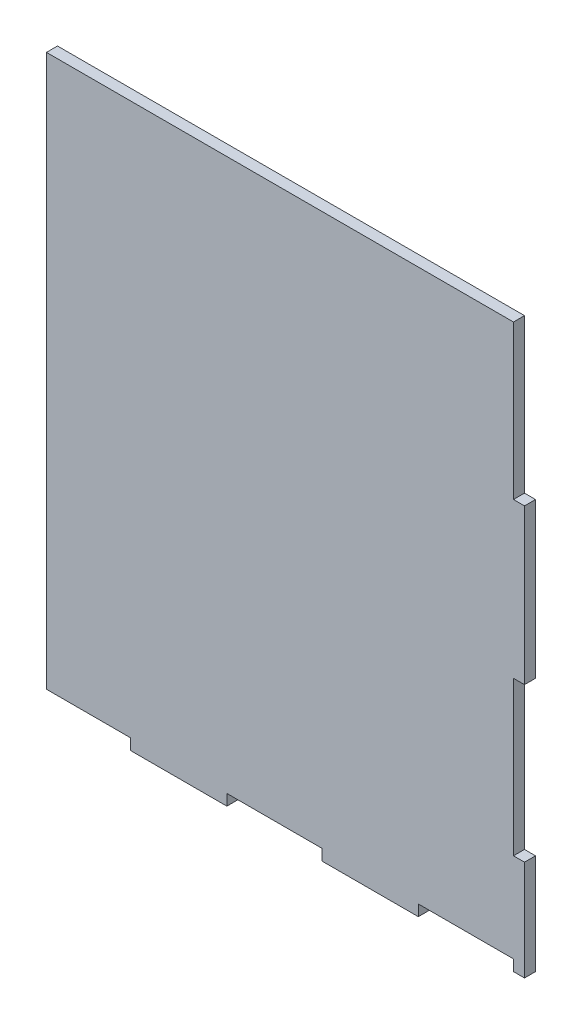
ISO-10303-21;
HEADER;
FILE_DESCRIPTION(('STEP AP214'),'2;1');
FILE_NAME('part.step','',(''),(''),'','','');
FILE_SCHEMA(('AUTOMOTIVE_DESIGN { 1 0 10303 214 1 1 1 1 }'));
ENDSEC;
DATA;
#1=APPLICATION_CONTEXT('core data for automotive mechanical design processes');
#2=APPLICATION_PROTOCOL_DEFINITION('international standard','automotive_design',2000,#1);
#3=PRODUCT_CONTEXT('',#1,'mechanical');
#4=PRODUCT('Part','Part','',(#3));
#5=PRODUCT_RELATED_PRODUCT_CATEGORY('part','',(#4));
#6=PRODUCT_DEFINITION_FORMATION('','',#4);
#7=PRODUCT_DEFINITION_CONTEXT('part definition',#1,'design');
#8=PRODUCT_DEFINITION('design','',#6,#7);
#9=PRODUCT_DEFINITION_SHAPE('','',#8);
#10=(LENGTH_UNIT() NAMED_UNIT(*) SI_UNIT(.MILLI.,.METRE.));
#11=(NAMED_UNIT(*) PLANE_ANGLE_UNIT() SI_UNIT($,.RADIAN.));
#12=(NAMED_UNIT(*) SI_UNIT($,.STERADIAN.) SOLID_ANGLE_UNIT());
#13=UNCERTAINTY_MEASURE_WITH_UNIT(LENGTH_MEASURE(1.E-05),#10,'distance_accuracy_value','');
#14=(GEOMETRIC_REPRESENTATION_CONTEXT(3) GLOBAL_UNCERTAINTY_ASSIGNED_CONTEXT((#13)) GLOBAL_UNIT_ASSIGNED_CONTEXT((#10,
#11,#12)) REPRESENTATION_CONTEXT('',''));
#15=CARTESIAN_POINT('',(0.,0.,0.));
#16=DIRECTION('',(0.,0.,1.));
#17=DIRECTION('',(1.,0.,0.));
#18=AXIS2_PLACEMENT_3D('',#15,#16,#17);
#19=CARTESIAN_POINT('',(65.7414448669211,0.,3.));
#20=DIRECTION('',(1.,0.,0.));
#21=DIRECTION('',(0.,0.,-1.));
#22=AXIS2_PLACEMENT_3D('',#19,#20,#21);
#23=PLANE('',#22);
#24=DIRECTION('',(0.,-1.,0.));
#25=VECTOR('',#24,1.);
#26=CARTESIAN_POINT('',(65.7414448669211,0.,0.));
#27=LINE('',#26,#25);
#28=CARTESIAN_POINT('',(65.7414448669211,75.8555133079858,0.));
#29=VERTEX_POINT('',#28);
#30=CARTESIAN_POINT('',(65.7414448669211,34.0483704479859,0.));
#31=VERTEX_POINT('',#30);
#32=EDGE_CURVE('E205',#29,#31,#27,.T.);
#33=ORIENTED_EDGE('',*,*,#32,.F.);
#34=DIRECTION('',(0.,0.,-1.));
#35=VECTOR('',#34,1.);
#36=CARTESIAN_POINT('',(65.7414448669211,75.8555133079858,3.));
#37=LINE('',#36,#35);
#38=CARTESIAN_POINT('',(65.7414448669211,75.8555133079858,3.));
#39=VERTEX_POINT('',#38);
#40=EDGE_CURVE('E11',#39,#29,#37,.T.);
#41=ORIENTED_EDGE('',*,*,#40,.F.);
#42=DIRECTION('',(0.,-1.,0.));
#43=VECTOR('',#42,1.);
#44=CARTESIAN_POINT('',(65.7414448669211,0.,3.));
#45=LINE('',#44,#43);
#46=CARTESIAN_POINT('',(65.7414448669211,34.0483704479859,3.));
#47=VERTEX_POINT('',#46);
#48=EDGE_CURVE('E260',#39,#47,#45,.T.);
#49=ORIENTED_EDGE('',*,*,#48,.T.);
#50=DIRECTION('',(0.,0.,-1.));
#51=VECTOR('',#50,1.);
#52=CARTESIAN_POINT('',(65.7414448669211,34.0483704479859,3.));
#53=LINE('',#52,#51);
#54=EDGE_CURVE('E55',#47,#31,#53,.T.);
#55=ORIENTED_EDGE('',*,*,#54,.T.);
#56=EDGE_LOOP('',(#33,#41,#49,#55));
#57=FACE_BOUND('',#56,.T.);
#58=ADVANCED_FACE('F39',(#57),#23,.T.);
#59=CARTESIAN_POINT('',(0.,75.8555133079858,3.));
#60=DIRECTION('',(0.,-1.,0.));
#61=DIRECTION('',(1.,0.,0.));
#62=AXIS2_PLACEMENT_3D('',#59,#60,#61);
#63=PLANE('',#62);
#64=DIRECTION('',(-1.,0.,0.));
#65=VECTOR('',#64,1.);
#66=CARTESIAN_POINT('',(0.,75.8555133079858,0.));
#67=LINE('',#66,#65);
#68=CARTESIAN_POINT('',(-61.2585551330752,75.8555133079858,0.));
#69=VERTEX_POINT('',#68);
#70=EDGE_CURVE('E207',#29,#69,#67,.T.);
#71=ORIENTED_EDGE('',*,*,#70,.T.);
#72=DIRECTION('',(0.,0.,-1.));
#73=VECTOR('',#72,1.);
#74=CARTESIAN_POINT('',(-61.2585551330752,75.8555133079858,3.));
#75=LINE('',#74,#73);
#76=CARTESIAN_POINT('',(-61.2585551330752,75.8555133079858,3.));
#77=VERTEX_POINT('',#76);
#78=EDGE_CURVE('E47',#77,#69,#75,.T.);
#79=ORIENTED_EDGE('',*,*,#78,.F.);
#80=DIRECTION('',(-1.,0.,0.));
#81=VECTOR('',#80,1.);
#82=CARTESIAN_POINT('',(0.,75.8555133079858,3.));
#83=LINE('',#82,#81);
#84=EDGE_CURVE('E316',#39,#77,#83,.T.);
#85=ORIENTED_EDGE('',*,*,#84,.F.);
#86=ORIENTED_EDGE('',*,*,#40,.T.);
#87=EDGE_LOOP('',(#71,#79,#85,#86));
#88=FACE_BOUND('',#87,.T.);
#89=ADVANCED_FACE('F365',(#88),#63,.F.);
#90=CARTESIAN_POINT('',(-61.2585551330752,0.,3.));
#91=DIRECTION('',(1.,0.,0.));
#92=DIRECTION('',(0.,1.,0.));
#93=AXIS2_PLACEMENT_3D('',#90,#91,#92);
#94=PLANE('',#93);
#95=DIRECTION('',(0.,-1.,0.));
#96=VECTOR('',#95,1.);
#97=CARTESIAN_POINT('',(-61.2585551330752,0.,0.));
#98=LINE('',#97,#96);
#99=CARTESIAN_POINT('',(-61.2585551330752,-74.1444866920142,0.));
#100=VERTEX_POINT('',#99);
#101=EDGE_CURVE('E209',#69,#100,#98,.T.);
#102=ORIENTED_EDGE('',*,*,#101,.T.);
#103=DIRECTION('',(0.,0.,-1.));
#104=VECTOR('',#103,1.);
#105=CARTESIAN_POINT('',(-61.2585551330752,-74.1444866920142,3.));
#106=LINE('',#105,#104);
#107=CARTESIAN_POINT('',(-61.2585551330752,-74.1444866920142,3.));
#108=VERTEX_POINT('',#107);
#109=EDGE_CURVE('E290',#108,#100,#106,.T.);
#110=ORIENTED_EDGE('',*,*,#109,.F.);
#111=DIRECTION('',(0.,-1.,0.));
#112=VECTOR('',#111,1.);
#113=CARTESIAN_POINT('',(-61.2585551330752,0.,3.));
#114=LINE('',#113,#112);
#115=EDGE_CURVE('E298',#77,#108,#114,.T.);
#116=ORIENTED_EDGE('',*,*,#115,.F.);
#117=ORIENTED_EDGE('',*,*,#78,.T.);
#118=EDGE_LOOP('',(#102,#110,#116,#117));
#119=FACE_BOUND('',#118,.T.);
#120=ADVANCED_FACE('F296',(#119),#94,.F.);
#121=CARTESIAN_POINT('',(0.,-74.1444866920142,3.));
#122=DIRECTION('',(0.,-1.,0.));
#123=DIRECTION('',(0.,0.,-1.));
#124=AXIS2_PLACEMENT_3D('',#121,#122,#123);
#125=PLANE('',#124);
#126=DIRECTION('',(-1.,0.,0.));
#127=VECTOR('',#126,1.);
#128=CARTESIAN_POINT('',(0.,-74.1444866920142,0.));
#129=LINE('',#128,#127);
#130=CARTESIAN_POINT('',(-38.3785551330789,-74.1444866920142,0.));
#131=VERTEX_POINT('',#130);
#132=EDGE_CURVE('E212',#131,#100,#129,.T.);
#133=ORIENTED_EDGE('',*,*,#132,.F.);
#134=DIRECTION('',(0.,0.,-1.));
#135=VECTOR('',#134,1.);
#136=CARTESIAN_POINT('',(-38.3785551330789,-74.1444866920142,3.));
#137=LINE('',#136,#135);
#138=CARTESIAN_POINT('',(-38.3785551330789,-74.1444866920142,3.));
#139=VERTEX_POINT('',#138);
#140=EDGE_CURVE('E288',#139,#131,#137,.T.);
#141=ORIENTED_EDGE('',*,*,#140,.F.);
#142=DIRECTION('',(-1.,0.,0.));
#143=VECTOR('',#142,1.);
#144=CARTESIAN_POINT('',(0.,-74.1444866920142,3.));
#145=LINE('',#144,#143);
#146=EDGE_CURVE('E309',#139,#108,#145,.T.);
#147=ORIENTED_EDGE('',*,*,#146,.T.);
#148=ORIENTED_EDGE('',*,*,#109,.T.);
#149=EDGE_LOOP('',(#133,#141,#147,#148));
#150=FACE_BOUND('',#149,.T.);
#151=ADVANCED_FACE('F306',(#150),#125,.T.);
#152=CARTESIAN_POINT('',(-38.3785551330789,0.,3.));
#153=DIRECTION('',(-1.,0.,0.));
#154=DIRECTION('',(0.,0.,1.));
#155=AXIS2_PLACEMENT_3D('',#152,#153,#154);
#156=PLANE('',#155);
#157=DIRECTION('',(0.,1.,0.));
#158=VECTOR('',#157,1.);
#159=CARTESIAN_POINT('',(-38.3785551330789,0.,0.));
#160=LINE('',#159,#158);
#161=CARTESIAN_POINT('',(-38.3785551330789,-77.1444866920178,0.));
#162=VERTEX_POINT('',#161);
#163=EDGE_CURVE('E215',#162,#131,#160,.T.);
#164=ORIENTED_EDGE('',*,*,#163,.F.);
#165=DIRECTION('',(0.,0.,-1.));
#166=VECTOR('',#165,1.);
#167=CARTESIAN_POINT('',(-38.3785551330789,-77.1444866920178,3.));
#168=LINE('',#167,#166);
#169=CARTESIAN_POINT('',(-38.3785551330789,-77.1444866920178,3.));
#170=VERTEX_POINT('',#169);
#171=EDGE_CURVE('E286',#170,#162,#168,.T.);
#172=ORIENTED_EDGE('',*,*,#171,.F.);
#173=DIRECTION('',(0.,1.,0.));
#174=VECTOR('',#173,1.);
#175=CARTESIAN_POINT('',(-38.3785551330789,0.,3.));
#176=LINE('',#175,#174);
#177=EDGE_CURVE('E312',#170,#139,#176,.T.);
#178=ORIENTED_EDGE('',*,*,#177,.T.);
#179=ORIENTED_EDGE('',*,*,#140,.T.);
#180=EDGE_LOOP('',(#164,#172,#178,#179));
#181=FACE_BOUND('',#180,.T.);
#182=ADVANCED_FACE('F376',(#181),#156,.T.);
#183=CARTESIAN_POINT('',(0.,-77.1444866920178,3.));
#184=DIRECTION('',(0.,-1.,0.));
#185=DIRECTION('',(0.,0.,-1.));
#186=AXIS2_PLACEMENT_3D('',#183,#184,#185);
#187=PLANE('',#186);
#188=DIRECTION('',(-1.,0.,0.));
#189=VECTOR('',#188,1.);
#190=CARTESIAN_POINT('',(0.,-77.1444866920178,0.));
#191=LINE('',#190,#189);
#192=CARTESIAN_POINT('',(-12.1985551330789,-77.1444866920178,0.));
#193=VERTEX_POINT('',#192);
#194=EDGE_CURVE('E218',#193,#162,#191,.T.);
#195=ORIENTED_EDGE('',*,*,#194,.F.);
#196=DIRECTION('',(0.,0.,-1.));
#197=VECTOR('',#196,1.);
#198=CARTESIAN_POINT('',(-12.1985551330789,-77.1444866920178,3.));
#199=LINE('',#198,#197);
#200=CARTESIAN_POINT('',(-12.1985551330789,-77.1444866920178,3.));
#201=VERTEX_POINT('',#200);
#202=EDGE_CURVE('E284',#201,#193,#199,.T.);
#203=ORIENTED_EDGE('',*,*,#202,.F.);
#204=DIRECTION('',(-1.,0.,0.));
#205=VECTOR('',#204,1.);
#206=CARTESIAN_POINT('',(0.,-77.1444866920178,3.));
#207=LINE('',#206,#205);
#208=EDGE_CURVE('E314',#201,#170,#207,.T.);
#209=ORIENTED_EDGE('',*,*,#208,.T.);
#210=ORIENTED_EDGE('',*,*,#171,.T.);
#211=EDGE_LOOP('',(#195,#203,#209,#210));
#212=FACE_BOUND('',#211,.T.);
#213=ADVANCED_FACE('F379',(#212),#187,.T.);
#214=CARTESIAN_POINT('',(-12.1985551330789,0.,3.));
#215=DIRECTION('',(1.,0.,0.));
#216=DIRECTION('',(0.,0.,-1.));
#217=AXIS2_PLACEMENT_3D('',#214,#215,#216);
#218=PLANE('',#217);
#219=DIRECTION('',(0.,-1.,0.));
#220=VECTOR('',#219,1.);
#221=CARTESIAN_POINT('',(-12.1985551330789,0.,0.));
#222=LINE('',#221,#220);
#223=CARTESIAN_POINT('',(-12.1985551330789,-74.1444866920142,0.));
#224=VERTEX_POINT('',#223);
#225=EDGE_CURVE('E221',#224,#193,#222,.T.);
#226=ORIENTED_EDGE('',*,*,#225,.F.);
#227=DIRECTION('',(0.,0.,-1.));
#228=VECTOR('',#227,1.);
#229=CARTESIAN_POINT('',(-12.1985551330789,-74.1444866920142,3.));
#230=LINE('',#229,#228);
#231=CARTESIAN_POINT('',(-12.1985551330789,-74.1444866920142,3.));
#232=VERTEX_POINT('',#231);
#233=EDGE_CURVE('E282',#232,#224,#230,.T.);
#234=ORIENTED_EDGE('',*,*,#233,.F.);
#235=DIRECTION('',(0.,-1.,0.));
#236=VECTOR('',#235,1.);
#237=CARTESIAN_POINT('',(-12.1985551330789,0.,3.));
#238=LINE('',#237,#236);
#239=EDGE_CURVE('E322',#232,#201,#238,.T.);
#240=ORIENTED_EDGE('',*,*,#239,.T.);
#241=ORIENTED_EDGE('',*,*,#202,.T.);
#242=EDGE_LOOP('',(#226,#234,#240,#241));
#243=FACE_BOUND('',#242,.T.);
#244=ADVANCED_FACE('F383',(#243),#218,.T.);
#245=CARTESIAN_POINT('',(0.,-74.1444866920142,3.));
#246=DIRECTION('',(0.,-1.,0.));
#247=DIRECTION('',(0.,0.,-1.));
#248=AXIS2_PLACEMENT_3D('',#245,#246,#247);
#249=PLANE('',#248);
#250=DIRECTION('',(-1.,0.,0.));
#251=VECTOR('',#250,1.);
#252=CARTESIAN_POINT('',(0.,-74.1444866920142,0.));
#253=LINE('',#252,#251);
#254=CARTESIAN_POINT('',(13.6814448669211,-74.1444866920142,0.));
#255=VERTEX_POINT('',#254);
#256=EDGE_CURVE('E224',#255,#224,#253,.T.);
#257=ORIENTED_EDGE('',*,*,#256,.F.);
#258=DIRECTION('',(0.,0.,-1.));
#259=VECTOR('',#258,1.);
#260=CARTESIAN_POINT('',(13.6814448669211,-74.1444866920142,3.));
#261=LINE('',#260,#259);
#262=CARTESIAN_POINT('',(13.6814448669211,-74.1444866920142,3.));
#263=VERTEX_POINT('',#262);
#264=EDGE_CURVE('E280',#263,#255,#261,.T.);
#265=ORIENTED_EDGE('',*,*,#264,.F.);
#266=DIRECTION('',(-1.,0.,0.));
#267=VECTOR('',#266,1.);
#268=CARTESIAN_POINT('',(0.,-74.1444866920142,3.));
#269=LINE('',#268,#267);
#270=EDGE_CURVE('E325',#263,#232,#269,.T.);
#271=ORIENTED_EDGE('',*,*,#270,.T.);
#272=ORIENTED_EDGE('',*,*,#233,.T.);
#273=EDGE_LOOP('',(#257,#265,#271,#272));
#274=FACE_BOUND('',#273,.T.);
#275=ADVANCED_FACE('F387',(#274),#249,.T.);
#276=CARTESIAN_POINT('',(13.681444866921,0.,3.));
#277=DIRECTION('',(-1.,0.,0.));
#278=DIRECTION('',(0.,-1.,0.));
#279=AXIS2_PLACEMENT_3D('',#276,#277,#278);
#280=PLANE('',#279);
#281=DIRECTION('',(0.,1.,0.));
#282=VECTOR('',#281,1.);
#283=CARTESIAN_POINT('',(13.681444866921,0.,0.));
#284=LINE('',#283,#282);
#285=CARTESIAN_POINT('',(13.6814448669211,-77.1444866920178,0.));
#286=VERTEX_POINT('',#285);
#287=EDGE_CURVE('E227',#286,#255,#284,.T.);
#288=ORIENTED_EDGE('',*,*,#287,.F.);
#289=DIRECTION('',(0.,0.,-1.));
#290=VECTOR('',#289,1.);
#291=CARTESIAN_POINT('',(13.6814448669211,-77.1444866920178,3.));
#292=LINE('',#291,#290);
#293=CARTESIAN_POINT('',(13.6814448669211,-77.1444866920178,3.));
#294=VERTEX_POINT('',#293);
#295=EDGE_CURVE('E278',#294,#286,#292,.T.);
#296=ORIENTED_EDGE('',*,*,#295,.F.);
#297=DIRECTION('',(0.,1.,0.));
#298=VECTOR('',#297,1.);
#299=CARTESIAN_POINT('',(13.681444866921,0.,3.));
#300=LINE('',#299,#298);
#301=EDGE_CURVE('E328',#294,#263,#300,.T.);
#302=ORIENTED_EDGE('',*,*,#301,.T.);
#303=ORIENTED_EDGE('',*,*,#264,.T.);
#304=EDGE_LOOP('',(#288,#296,#302,#303));
#305=FACE_BOUND('',#304,.T.);
#306=ADVANCED_FACE('F391',(#305),#280,.T.);
#307=CARTESIAN_POINT('',(0.,-77.1444866920178,3.));
#308=DIRECTION('',(0.,-1.,0.));
#309=DIRECTION('',(0.,0.,-1.));
#310=AXIS2_PLACEMENT_3D('',#307,#308,#309);
#311=PLANE('',#310);
#312=DIRECTION('',(-1.,0.,0.));
#313=VECTOR('',#312,1.);
#314=CARTESIAN_POINT('',(0.,-77.1444866920178,0.));
#315=LINE('',#314,#313);
#316=CARTESIAN_POINT('',(39.8614448669211,-77.1444866920178,0.));
#317=VERTEX_POINT('',#316);
#318=EDGE_CURVE('E230',#317,#286,#315,.T.);
#319=ORIENTED_EDGE('',*,*,#318,.F.);
#320=DIRECTION('',(0.,0.,-1.));
#321=VECTOR('',#320,1.);
#322=CARTESIAN_POINT('',(39.8614448669211,-77.1444866920178,3.));
#323=LINE('',#322,#321);
#324=CARTESIAN_POINT('',(39.8614448669211,-77.1444866920178,3.));
#325=VERTEX_POINT('',#324);
#326=EDGE_CURVE('E276',#325,#317,#323,.T.);
#327=ORIENTED_EDGE('',*,*,#326,.F.);
#328=DIRECTION('',(-1.,0.,0.));
#329=VECTOR('',#328,1.);
#330=CARTESIAN_POINT('',(0.,-77.1444866920178,3.));
#331=LINE('',#330,#329);
#332=EDGE_CURVE('E331',#325,#294,#331,.T.);
#333=ORIENTED_EDGE('',*,*,#332,.T.);
#334=ORIENTED_EDGE('',*,*,#295,.T.);
#335=EDGE_LOOP('',(#319,#327,#333,#334));
#336=FACE_BOUND('',#335,.T.);
#337=ADVANCED_FACE('F395',(#336),#311,.T.);
#338=CARTESIAN_POINT('',(39.8614448669211,0.,3.));
#339=DIRECTION('',(1.,0.,0.));
#340=DIRECTION('',(0.,0.,-1.));
#341=AXIS2_PLACEMENT_3D('',#338,#339,#340);
#342=PLANE('',#341);
#343=DIRECTION('',(0.,-1.,0.));
#344=VECTOR('',#343,1.);
#345=CARTESIAN_POINT('',(39.8614448669211,0.,0.));
#346=LINE('',#345,#344);
#347=CARTESIAN_POINT('',(39.8614448669211,-74.1444866920142,0.));
#348=VERTEX_POINT('',#347);
#349=EDGE_CURVE('E233',#348,#317,#346,.T.);
#350=ORIENTED_EDGE('',*,*,#349,.F.);
#351=DIRECTION('',(0.,0.,-1.));
#352=VECTOR('',#351,1.);
#353=CARTESIAN_POINT('',(39.8614448669211,-74.1444866920142,3.));
#354=LINE('',#353,#352);
#355=CARTESIAN_POINT('',(39.8614448669211,-74.1444866920142,3.));
#356=VERTEX_POINT('',#355);
#357=EDGE_CURVE('E274',#356,#348,#354,.T.);
#358=ORIENTED_EDGE('',*,*,#357,.F.);
#359=DIRECTION('',(0.,-1.,0.));
#360=VECTOR('',#359,1.);
#361=CARTESIAN_POINT('',(39.8614448669211,0.,3.));
#362=LINE('',#361,#360);
#363=EDGE_CURVE('E334',#356,#325,#362,.T.);
#364=ORIENTED_EDGE('',*,*,#363,.T.);
#365=ORIENTED_EDGE('',*,*,#326,.T.);
#366=EDGE_LOOP('',(#350,#358,#364,#365));
#367=FACE_BOUND('',#366,.T.);
#368=ADVANCED_FACE('F399',(#367),#342,.T.);
#369=CARTESIAN_POINT('',(0.,-74.1444866920142,3.));
#370=DIRECTION('',(0.,-1.,0.));
#371=DIRECTION('',(0.,0.,-1.));
#372=AXIS2_PLACEMENT_3D('',#369,#370,#371);
#373=PLANE('',#372);
#374=DIRECTION('',(-1.,0.,0.));
#375=VECTOR('',#374,1.);
#376=CARTESIAN_POINT('',(0.,-74.1444866920142,0.));
#377=LINE('',#376,#375);
#378=CARTESIAN_POINT('',(65.7414448669211,-74.1444866920142,0.));
#379=VERTEX_POINT('',#378);
#380=EDGE_CURVE('E236',#379,#348,#377,.T.);
#381=ORIENTED_EDGE('',*,*,#380,.F.);
#382=DIRECTION('',(0.,0.,-1.));
#383=VECTOR('',#382,1.);
#384=CARTESIAN_POINT('',(65.7414448669211,-74.1444866920142,3.));
#385=LINE('',#384,#383);
#386=CARTESIAN_POINT('',(65.7414448669211,-74.1444866920142,3.));
#387=VERTEX_POINT('',#386);
#388=EDGE_CURVE('E272',#387,#379,#385,.T.);
#389=ORIENTED_EDGE('',*,*,#388,.F.);
#390=DIRECTION('',(-1.,0.,0.));
#391=VECTOR('',#390,1.);
#392=CARTESIAN_POINT('',(0.,-74.1444866920142,3.));
#393=LINE('',#392,#391);
#394=EDGE_CURVE('E337',#387,#356,#393,.T.);
#395=ORIENTED_EDGE('',*,*,#394,.T.);
#396=ORIENTED_EDGE('',*,*,#357,.T.);
#397=EDGE_LOOP('',(#381,#389,#395,#396));
#398=FACE_BOUND('',#397,.T.);
#399=ADVANCED_FACE('F403',(#398),#373,.T.);
#400=CARTESIAN_POINT('',(65.7414448669211,0.,3.));
#401=DIRECTION('',(-1.,0.,0.));
#402=DIRECTION('',(0.,0.,1.));
#403=AXIS2_PLACEMENT_3D('',#400,#401,#402);
#404=PLANE('',#403);
#405=DIRECTION('',(0.,1.,0.));
#406=VECTOR('',#405,1.);
#407=CARTESIAN_POINT('',(65.7414448669211,0.,0.));
#408=LINE('',#407,#406);
#409=CARTESIAN_POINT('',(65.7414448669211,-77.1444866920178,0.));
#410=VERTEX_POINT('',#409);
#411=EDGE_CURVE('E239',#410,#379,#408,.T.);
#412=ORIENTED_EDGE('',*,*,#411,.F.);
#413=DIRECTION('',(0.,0.,-1.));
#414=VECTOR('',#413,1.);
#415=CARTESIAN_POINT('',(65.7414448669211,-77.1444866920178,3.));
#416=LINE('',#415,#414);
#417=CARTESIAN_POINT('',(65.7414448669211,-77.1444866920178,3.));
#418=VERTEX_POINT('',#417);
#419=EDGE_CURVE('E270',#418,#410,#416,.T.);
#420=ORIENTED_EDGE('',*,*,#419,.F.);
#421=DIRECTION('',(0.,1.,0.));
#422=VECTOR('',#421,1.);
#423=CARTESIAN_POINT('',(65.7414448669211,0.,3.));
#424=LINE('',#423,#422);
#425=EDGE_CURVE('E340',#418,#387,#424,.T.);
#426=ORIENTED_EDGE('',*,*,#425,.T.);
#427=ORIENTED_EDGE('',*,*,#388,.T.);
#428=EDGE_LOOP('',(#412,#420,#426,#427));
#429=FACE_BOUND('',#428,.T.);
#430=ADVANCED_FACE('F407',(#429),#404,.T.);
#431=CARTESIAN_POINT('',(0.,-77.1444866920178,3.));
#432=DIRECTION('',(0.,-1.,0.));
#433=DIRECTION('',(0.,0.,-1.));
#434=AXIS2_PLACEMENT_3D('',#431,#432,#433);
#435=PLANE('',#434);
#436=DIRECTION('',(-1.,0.,0.));
#437=VECTOR('',#436,1.);
#438=CARTESIAN_POINT('',(0.,-77.1444866920178,0.));
#439=LINE('',#438,#437);
#440=CARTESIAN_POINT('',(68.7414448669248,-77.1444866920178,0.));
#441=VERTEX_POINT('',#440);
#442=EDGE_CURVE('E242',#441,#410,#439,.T.);
#443=ORIENTED_EDGE('',*,*,#442,.F.);
#444=DIRECTION('',(0.,0.,-1.));
#445=VECTOR('',#444,1.);
#446=CARTESIAN_POINT('',(68.7414448669248,-77.1444866920178,3.));
#447=LINE('',#446,#445);
#448=CARTESIAN_POINT('',(68.7414448669248,-77.1444866920178,3.));
#449=VERTEX_POINT('',#448);
#450=EDGE_CURVE('E268',#449,#441,#447,.T.);
#451=ORIENTED_EDGE('',*,*,#450,.F.);
#452=DIRECTION('',(-1.,0.,0.));
#453=VECTOR('',#452,1.);
#454=CARTESIAN_POINT('',(0.,-77.1444866920178,3.));
#455=LINE('',#454,#453);
#456=EDGE_CURVE('E343',#449,#418,#455,.T.);
#457=ORIENTED_EDGE('',*,*,#456,.T.);
#458=ORIENTED_EDGE('',*,*,#419,.T.);
#459=EDGE_LOOP('',(#443,#451,#457,#458));
#460=FACE_BOUND('',#459,.T.);
#461=ADVANCED_FACE('F411',(#460),#435,.T.);
#462=CARTESIAN_POINT('',(68.7414448669247,0.,3.));
#463=DIRECTION('',(-1.,0.,0.));
#464=DIRECTION('',(0.,-1.,0.));
#465=AXIS2_PLACEMENT_3D('',#462,#463,#464);
#466=PLANE('',#465);
#467=DIRECTION('',(0.,1.,0.));
#468=VECTOR('',#467,1.);
#469=CARTESIAN_POINT('',(68.7414448669247,0.,0.));
#470=LINE('',#469,#468);
#471=CARTESIAN_POINT('',(68.7414448669248,-49.8659152720142,0.));
#472=VERTEX_POINT('',#471);
#473=EDGE_CURVE('E245',#441,#472,#470,.T.);
#474=ORIENTED_EDGE('',*,*,#473,.T.);
#475=DIRECTION('',(0.,0.,-1.));
#476=VECTOR('',#475,1.);
#477=CARTESIAN_POINT('',(68.7414448669248,-49.8659152720142,3.));
#478=LINE('',#477,#476);
#479=CARTESIAN_POINT('',(68.7414448669248,-49.8659152720142,3.));
#480=VERTEX_POINT('',#479);
#481=EDGE_CURVE('E266',#480,#472,#478,.T.);
#482=ORIENTED_EDGE('',*,*,#481,.F.);
#483=DIRECTION('',(0.,1.,0.));
#484=VECTOR('',#483,1.);
#485=CARTESIAN_POINT('',(68.7414448669247,0.,3.));
#486=LINE('',#485,#484);
#487=EDGE_CURVE('E346',#449,#480,#486,.T.);
#488=ORIENTED_EDGE('',*,*,#487,.F.);
#489=ORIENTED_EDGE('',*,*,#450,.T.);
#490=EDGE_LOOP('',(#474,#482,#488,#489));
#491=FACE_BOUND('',#490,.T.);
#492=ADVANCED_FACE('F415',(#491),#466,.F.);
#493=CARTESIAN_POINT('',(-1.15338098497769E-13,-49.8659152720141,3.));
#494=DIRECTION('',(0.,1.,0.));
#495=DIRECTION('',(-1.,0.,0.));
#496=AXIS2_PLACEMENT_3D('',#493,#494,#495);
#497=PLANE('',#496);
#498=DIRECTION('',(1.,0.,0.));
#499=VECTOR('',#498,1.);
#500=CARTESIAN_POINT('',(-1.15338098497769E-13,-49.8659152720141,0.));
#501=LINE('',#500,#499);
#502=CARTESIAN_POINT('',(65.7414448669211,-49.8659152720142,0.));
#503=VERTEX_POINT('',#502);
#504=EDGE_CURVE('E248',#503,#472,#501,.T.);
#505=ORIENTED_EDGE('',*,*,#504,.F.);
#506=DIRECTION('',(0.,0.,-1.));
#507=VECTOR('',#506,1.);
#508=CARTESIAN_POINT('',(65.7414448669211,-49.8659152720142,3.));
#509=LINE('',#508,#507);
#510=CARTESIAN_POINT('',(65.7414448669211,-49.8659152720142,3.));
#511=VERTEX_POINT('',#510);
#512=EDGE_CURVE('E264',#511,#503,#509,.T.);
#513=ORIENTED_EDGE('',*,*,#512,.F.);
#514=DIRECTION('',(1.,0.,0.));
#515=VECTOR('',#514,1.);
#516=CARTESIAN_POINT('',(-1.15338098497769E-13,-49.8659152720141,3.));
#517=LINE('',#516,#515);
#518=EDGE_CURVE('E348',#511,#480,#517,.T.);
#519=ORIENTED_EDGE('',*,*,#518,.T.);
#520=ORIENTED_EDGE('',*,*,#481,.T.);
#521=EDGE_LOOP('',(#505,#513,#519,#520));
#522=FACE_BOUND('',#521,.T.);
#523=ADVANCED_FACE('F419',(#522),#497,.T.);
#524=CARTESIAN_POINT('',(65.7414448669211,0.,3.));
#525=DIRECTION('',(1.,0.,0.));
#526=DIRECTION('',(0.,0.,-1.));
#527=AXIS2_PLACEMENT_3D('',#524,#525,#526);
#528=PLANE('',#527);
#529=DIRECTION('',(0.,-1.,0.));
#530=VECTOR('',#529,1.);
#531=CARTESIAN_POINT('',(65.7414448669211,0.,0.));
#532=LINE('',#531,#530);
#533=CARTESIAN_POINT('',(65.7414448669211,-8.05877241201412,0.));
#534=VERTEX_POINT('',#533);
#535=EDGE_CURVE('E251',#534,#503,#532,.T.);
#536=ORIENTED_EDGE('',*,*,#535,.F.);
#537=DIRECTION('',(0.,0.,-1.));
#538=VECTOR('',#537,1.);
#539=CARTESIAN_POINT('',(65.7414448669211,-8.05877241201412,3.));
#540=LINE('',#539,#538);
#541=CARTESIAN_POINT('',(65.7414448669211,-8.05877241201412,3.));
#542=VERTEX_POINT('',#541);
#543=EDGE_CURVE('E186',#542,#534,#540,.T.);
#544=ORIENTED_EDGE('',*,*,#543,.F.);
#545=DIRECTION('',(0.,-1.,0.));
#546=VECTOR('',#545,1.);
#547=CARTESIAN_POINT('',(65.7414448669211,0.,3.));
#548=LINE('',#547,#546);
#549=EDGE_CURVE('E197',#542,#511,#548,.T.);
#550=ORIENTED_EDGE('',*,*,#549,.T.);
#551=ORIENTED_EDGE('',*,*,#512,.T.);
#552=EDGE_LOOP('',(#536,#544,#550,#551));
#553=FACE_BOUND('',#552,.T.);
#554=ADVANCED_FACE('F352',(#553),#528,.T.);
#555=CARTESIAN_POINT('',(0.,-8.05877241201412,3.));
#556=DIRECTION('',(0.,-1.,0.));
#557=DIRECTION('',(0.,0.,-1.));
#558=AXIS2_PLACEMENT_3D('',#555,#556,#557);
#559=PLANE('',#558);
#560=DIRECTION('',(-1.,0.,0.));
#561=VECTOR('',#560,1.);
#562=CARTESIAN_POINT('',(0.,-8.05877241201412,0.));
#563=LINE('',#562,#561);
#564=CARTESIAN_POINT('',(68.7414448669248,-8.05877241201412,0.));
#565=VERTEX_POINT('',#564);
#566=EDGE_CURVE('E182',#565,#534,#563,.T.);
#567=ORIENTED_EDGE('',*,*,#566,.F.);
#568=DIRECTION('',(0.,0.,-1.));
#569=VECTOR('',#568,1.);
#570=CARTESIAN_POINT('',(68.7414448669248,-8.05877241201412,3.));
#571=LINE('',#570,#569);
#572=CARTESIAN_POINT('',(68.7414448669248,-8.05877241201412,3.));
#573=VERTEX_POINT('',#572);
#574=EDGE_CURVE('E177',#573,#565,#571,.T.);
#575=ORIENTED_EDGE('',*,*,#574,.F.);
#576=DIRECTION('',(-1.,0.,0.));
#577=VECTOR('',#576,1.);
#578=CARTESIAN_POINT('',(0.,-8.05877241201412,3.));
#579=LINE('',#578,#577);
#580=EDGE_CURVE('E180',#573,#542,#579,.T.);
#581=ORIENTED_EDGE('',*,*,#580,.T.);
#582=ORIENTED_EDGE('',*,*,#543,.T.);
#583=EDGE_LOOP('',(#567,#575,#581,#582));
#584=FACE_BOUND('',#583,.T.);
#585=ADVANCED_FACE('F179',(#584),#559,.T.);
#586=CARTESIAN_POINT('',(68.7414448669248,0.,3.));
#587=DIRECTION('',(1.,0.,0.));
#588=DIRECTION('',(0.,1.,0.));
#589=AXIS2_PLACEMENT_3D('',#586,#587,#588);
#590=PLANE('',#589);
#591=DIRECTION('',(0.,-1.,0.));
#592=VECTOR('',#591,1.);
#593=CARTESIAN_POINT('',(68.7414448669248,0.,0.));
#594=LINE('',#593,#592);
#595=CARTESIAN_POINT('',(68.7414448669248,34.0483704479859,0.));
#596=VERTEX_POINT('',#595);
#597=EDGE_CURVE('E255',#596,#565,#594,.T.);
#598=ORIENTED_EDGE('',*,*,#597,.F.);
#599=DIRECTION('',(0.,0.,-1.));
#600=VECTOR('',#599,1.);
#601=CARTESIAN_POINT('',(68.7414448669248,34.0483704479859,3.));
#602=LINE('',#601,#600);
#603=CARTESIAN_POINT('',(68.7414448669248,34.0483704479859,3.));
#604=VERTEX_POINT('',#603);
#605=EDGE_CURVE('E116',#604,#596,#602,.T.);
#606=ORIENTED_EDGE('',*,*,#605,.F.);
#607=DIRECTION('',(0.,-1.,0.));
#608=VECTOR('',#607,1.);
#609=CARTESIAN_POINT('',(68.7414448669248,0.,3.));
#610=LINE('',#609,#608);
#611=EDGE_CURVE('E194',#604,#573,#610,.T.);
#612=ORIENTED_EDGE('',*,*,#611,.T.);
#613=ORIENTED_EDGE('',*,*,#574,.T.);
#614=EDGE_LOOP('',(#598,#606,#612,#613));
#615=FACE_BOUND('',#614,.T.);
#616=ADVANCED_FACE('F199',(#615),#590,.T.);
#617=CARTESIAN_POINT('',(0.,34.0483704479859,3.));
#618=DIRECTION('',(0.,1.,0.));
#619=DIRECTION('',(0.,0.,1.));
#620=AXIS2_PLACEMENT_3D('',#617,#618,#619);
#621=PLANE('',#620);
#622=DIRECTION('',(1.,0.,0.));
#623=VECTOR('',#622,1.);
#624=CARTESIAN_POINT('',(0.,34.0483704479859,0.));
#625=LINE('',#624,#623);
#626=EDGE_CURVE('E257',#31,#596,#625,.T.);
#627=ORIENTED_EDGE('',*,*,#626,.F.);
#628=ORIENTED_EDGE('',*,*,#54,.F.);
#629=DIRECTION('',(1.,0.,0.));
#630=VECTOR('',#629,1.);
#631=CARTESIAN_POINT('',(0.,34.0483704479859,3.));
#632=LINE('',#631,#630);
#633=EDGE_CURVE('E200',#47,#604,#632,.T.);
#634=ORIENTED_EDGE('',*,*,#633,.T.);
#635=ORIENTED_EDGE('',*,*,#605,.T.);
#636=EDGE_LOOP('',(#627,#628,#634,#635));
#637=FACE_BOUND('',#636,.T.);
#638=ADVANCED_FACE('F354',(#637),#621,.T.);
#639=CARTESIAN_POINT('',(0.,0.,3.));
#640=DIRECTION('',(0.,0.,1.));
#641=DIRECTION('',(1.,0.,0.));
#642=AXIS2_PLACEMENT_3D('',#639,#640,#641);
#643=PLANE('',#642);
#644=ORIENTED_EDGE('',*,*,#48,.F.);
#645=ORIENTED_EDGE('',*,*,#84,.T.);
#646=ORIENTED_EDGE('',*,*,#115,.T.);
#647=ORIENTED_EDGE('',*,*,#146,.F.);
#648=ORIENTED_EDGE('',*,*,#177,.F.);
#649=ORIENTED_EDGE('',*,*,#208,.F.);
#650=ORIENTED_EDGE('',*,*,#239,.F.);
#651=ORIENTED_EDGE('',*,*,#270,.F.);
#652=ORIENTED_EDGE('',*,*,#301,.F.);
#653=ORIENTED_EDGE('',*,*,#332,.F.);
#654=ORIENTED_EDGE('',*,*,#363,.F.);
#655=ORIENTED_EDGE('',*,*,#394,.F.);
#656=ORIENTED_EDGE('',*,*,#425,.F.);
#657=ORIENTED_EDGE('',*,*,#456,.F.);
#658=ORIENTED_EDGE('',*,*,#487,.T.);
#659=ORIENTED_EDGE('',*,*,#518,.F.);
#660=ORIENTED_EDGE('',*,*,#549,.F.);
#661=ORIENTED_EDGE('',*,*,#580,.F.);
#662=ORIENTED_EDGE('',*,*,#611,.F.);
#663=ORIENTED_EDGE('',*,*,#633,.F.);
#664=EDGE_LOOP('',(#644,#645,#646,#647,#648,#649,#650,#651,#652,#653,#654,#655,#656,#657,#658,
#659,#660,#661,#662,#663));
#665=FACE_BOUND('',#664,.T.);
#666=ADVANCED_FACE('F192',(#665),#643,.T.);
#667=CARTESIAN_POINT('',(0.,0.,0.));
#668=DIRECTION('',(0.,0.,1.));
#669=DIRECTION('',(1.,0.,0.));
#670=AXIS2_PLACEMENT_3D('',#667,#668,#669);
#671=PLANE('',#670);
#672=ORIENTED_EDGE('',*,*,#32,.T.);
#673=ORIENTED_EDGE('',*,*,#626,.T.);
#674=ORIENTED_EDGE('',*,*,#597,.T.);
#675=ORIENTED_EDGE('',*,*,#566,.T.);
#676=ORIENTED_EDGE('',*,*,#535,.T.);
#677=ORIENTED_EDGE('',*,*,#504,.T.);
#678=ORIENTED_EDGE('',*,*,#473,.F.);
#679=ORIENTED_EDGE('',*,*,#442,.T.);
#680=ORIENTED_EDGE('',*,*,#411,.T.);
#681=ORIENTED_EDGE('',*,*,#380,.T.);
#682=ORIENTED_EDGE('',*,*,#349,.T.);
#683=ORIENTED_EDGE('',*,*,#318,.T.);
#684=ORIENTED_EDGE('',*,*,#287,.T.);
#685=ORIENTED_EDGE('',*,*,#256,.T.);
#686=ORIENTED_EDGE('',*,*,#225,.T.);
#687=ORIENTED_EDGE('',*,*,#194,.T.);
#688=ORIENTED_EDGE('',*,*,#163,.T.);
#689=ORIENTED_EDGE('',*,*,#132,.T.);
#690=ORIENTED_EDGE('',*,*,#101,.F.);
#691=ORIENTED_EDGE('',*,*,#70,.F.);
#692=EDGE_LOOP('',(#672,#673,#674,#675,#676,#677,#678,#679,#680,#681,#682,#683,#684,#685,#686,
#687,#688,#689,#690,#691));
#693=FACE_BOUND('',#692,.T.);
#694=ADVANCED_FACE('F302',(#693),#671,.F.);
#695=CLOSED_SHELL('',(#58,#89,#120,#151,#182,#213,#244,#275,#306,#337,#368,#399,#430,#461,#492,
#523,#554,#585,#616,#638,#666,#694));
#696=MANIFOLD_SOLID_BREP('B2',#695);
#697=ADVANCED_BREP_SHAPE_REPRESENTATION('',(#18,#696),#14);
#698=SHAPE_DEFINITION_REPRESENTATION(#9,#697);
ENDSEC;
END-ISO-10303-21;
